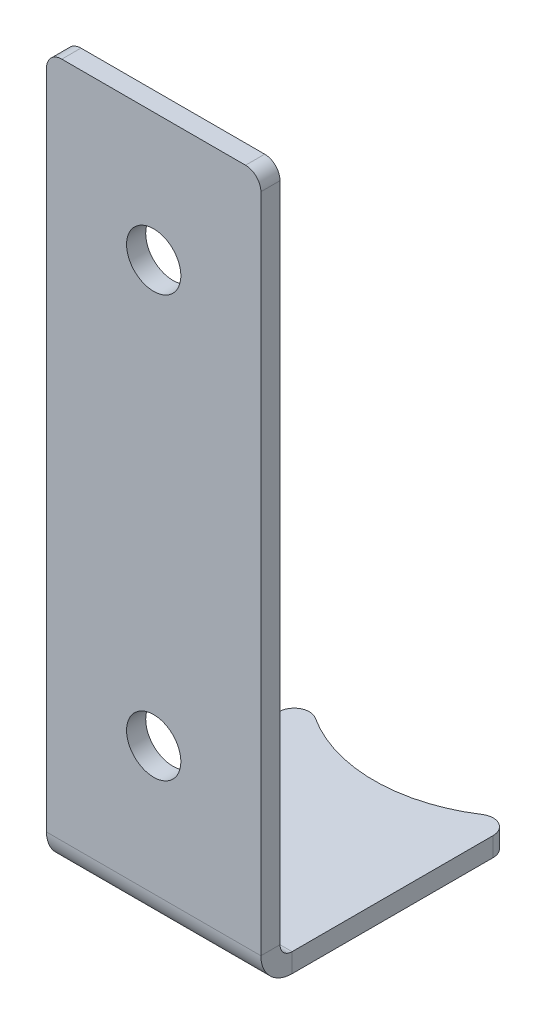
ISO-10303-21;
HEADER;
FILE_DESCRIPTION(('STEP AP214'),'2;1');
FILE_NAME('part.step','',(''),(''),'','','');
FILE_SCHEMA(('AUTOMOTIVE_DESIGN { 1 0 10303 214 1 1 1 1 }'));
ENDSEC;
DATA;
#1=APPLICATION_CONTEXT('core data for automotive mechanical design processes');
#2=APPLICATION_PROTOCOL_DEFINITION('international standard','automotive_design',2000,#1);
#3=PRODUCT_CONTEXT('',#1,'mechanical');
#4=PRODUCT('Part','Part','',(#3));
#5=PRODUCT_RELATED_PRODUCT_CATEGORY('part','',(#4));
#6=PRODUCT_DEFINITION_FORMATION('','',#4);
#7=PRODUCT_DEFINITION_CONTEXT('part definition',#1,'design');
#8=PRODUCT_DEFINITION('design','',#6,#7);
#9=PRODUCT_DEFINITION_SHAPE('','',#8);
#10=(LENGTH_UNIT() NAMED_UNIT(*) SI_UNIT(.MILLI.,.METRE.));
#11=(NAMED_UNIT(*) PLANE_ANGLE_UNIT() SI_UNIT($,.RADIAN.));
#12=(NAMED_UNIT(*) SI_UNIT($,.STERADIAN.) SOLID_ANGLE_UNIT());
#13=UNCERTAINTY_MEASURE_WITH_UNIT(LENGTH_MEASURE(1.E-05),#10,'distance_accuracy_value','');
#14=(GEOMETRIC_REPRESENTATION_CONTEXT(3) GLOBAL_UNCERTAINTY_ASSIGNED_CONTEXT((#13)) GLOBAL_UNIT_ASSIGNED_CONTEXT((#10,
#11,#12)) REPRESENTATION_CONTEXT('',''));
#15=CARTESIAN_POINT('',(0.,0.,0.));
#16=DIRECTION('',(0.,0.,1.));
#17=DIRECTION('',(1.,0.,0.));
#18=AXIS2_PLACEMENT_3D('',#15,#16,#17);
#19=CARTESIAN_POINT('',(0.,-1.5875,-1.14491749414469E-13));
#20=DIRECTION('',(0.,1.,0.));
#21=DIRECTION('',(0.,0.,1.));
#22=AXIS2_PLACEMENT_3D('',#19,#20,#21);
#23=CYLINDRICAL_SURFACE('',#22,12.7000000000001);
#24=CARTESIAN_POINT('',(0.,0.,-1.14491749414469E-13));
#25=DIRECTION('',(0.,-1.,0.));
#26=DIRECTION('',(0.,0.,1.));
#27=AXIS2_PLACEMENT_3D('',#24,#25,#26);
#28=CIRCLE('',#27,12.7000000000001);
#29=CARTESIAN_POINT('',(6.92727272727273,0.,10.6443831461472));
#30=VERTEX_POINT('',#29);
#31=CARTESIAN_POINT('',(-6.92727272727273,0.,10.6443831461472));
#32=VERTEX_POINT('',#31);
#33=EDGE_CURVE('E215',#30,#32,#28,.T.);
#34=ORIENTED_EDGE('',*,*,#33,.F.);
#35=DIRECTION('',(0.,1.,0.));
#36=VECTOR('',#35,1.);
#37=CARTESIAN_POINT('',(6.92727272727274,-1.5875,10.6443831461472));
#38=LINE('',#37,#36);
#39=CARTESIAN_POINT('',(6.92727272727273,-1.5875,10.6443831461472));
#40=VERTEX_POINT('',#39);
#41=EDGE_CURVE('E259',#30,#40,#38,.F.);
#42=ORIENTED_EDGE('',*,*,#41,.T.);
#43=CARTESIAN_POINT('',(0.,-1.5875,-1.14491749414469E-13));
#44=DIRECTION('',(0.,-1.,0.));
#45=DIRECTION('',(0.,0.,1.));
#46=AXIS2_PLACEMENT_3D('',#43,#44,#45);
#47=CIRCLE('',#46,12.7000000000001);
#48=CARTESIAN_POINT('',(-6.92727272727273,-1.5875,10.6443831461472));
#49=VERTEX_POINT('',#48);
#50=EDGE_CURVE('E218',#40,#49,#47,.T.);
#51=ORIENTED_EDGE('',*,*,#50,.T.);
#52=DIRECTION('',(0.,1.,0.));
#53=VECTOR('',#52,1.);
#54=CARTESIAN_POINT('',(-6.92727272727273,-1.5875,10.6443831461472));
#55=LINE('',#54,#53);
#56=EDGE_CURVE('E256',#49,#32,#55,.T.);
#57=ORIENTED_EDGE('',*,*,#56,.T.);
#58=EDGE_LOOP('',(#34,#42,#51,#57));
#59=FACE_BOUND('',#58,.T.);
#60=ADVANCED_FACE('F59',(#59),#23,.F.);
#61=CARTESIAN_POINT('',(8.89,-1.5875,9.06961410424942));
#62=DIRECTION('',(1.,0.,0.));
#63=DIRECTION('',(0.,0.,-1.));
#64=AXIS2_PLACEMENT_3D('',#61,#62,#63);
#65=PLANE('',#64);
#66=DIRECTION('',(0.,0.,-1.));
#67=VECTOR('',#66,1.);
#68=CARTESIAN_POINT('',(8.89,-1.5875,9.06961410424942));
#69=LINE('',#68,#67);
#70=CARTESIAN_POINT('',(8.89,-1.5875,28.3896141042494));
#71=VERTEX_POINT('',#70);
#72=CARTESIAN_POINT('',(8.89,-1.5875,11.7088214607619));
#73=VERTEX_POINT('',#72);
#74=EDGE_CURVE('E223',#71,#73,#69,.T.);
#75=ORIENTED_EDGE('',*,*,#74,.T.);
#76=DIRECTION('',(0.,1.,0.));
#77=VECTOR('',#76,1.);
#78=CARTESIAN_POINT('',(8.89,-1.5875,11.7088214607619));
#79=LINE('',#78,#77);
#80=CARTESIAN_POINT('',(8.89,0.,11.7088214607619));
#81=VERTEX_POINT('',#80);
#82=EDGE_CURVE('E249',#73,#81,#79,.T.);
#83=ORIENTED_EDGE('',*,*,#82,.T.);
#84=DIRECTION('',(0.,0.,-1.));
#85=VECTOR('',#84,1.);
#86=CARTESIAN_POINT('',(8.89,0.,9.06961410424942));
#87=LINE('',#86,#85);
#88=CARTESIAN_POINT('',(8.89,0.,28.3896141042494));
#89=VERTEX_POINT('',#88);
#90=EDGE_CURVE('E221',#89,#81,#87,.T.);
#91=ORIENTED_EDGE('',*,*,#90,.F.);
#92=DIRECTION('',(0.,-1.,0.));
#93=VECTOR('',#92,1.);
#94=CARTESIAN_POINT('',(8.89,0.,28.3896141042494));
#95=LINE('',#94,#93);
#96=EDGE_CURVE('E204',#89,#71,#95,.T.);
#97=ORIENTED_EDGE('',*,*,#96,.T.);
#98=EDGE_LOOP('',(#75,#83,#91,#97));
#99=FACE_BOUND('',#98,.T.);
#100=ADVANCED_FACE('F267',(#99),#65,.T.);
#101=CARTESIAN_POINT('',(-8.88999999999999,-1.5875,9.06961410424942));
#102=DIRECTION('',(-1.,0.,0.));
#103=DIRECTION('',(0.,0.,1.));
#104=AXIS2_PLACEMENT_3D('',#101,#102,#103);
#105=PLANE('',#104);
#106=DIRECTION('',(0.,0.,1.));
#107=VECTOR('',#106,1.);
#108=CARTESIAN_POINT('',(-8.88999999999999,0.,9.06961410424942));
#109=LINE('',#108,#107);
#110=CARTESIAN_POINT('',(-8.88999999999999,0.,11.708821460762));
#111=VERTEX_POINT('',#110);
#112=CARTESIAN_POINT('',(-8.88999999999999,0.,28.3896141042494));
#113=VERTEX_POINT('',#112);
#114=EDGE_CURVE('E229',#111,#113,#109,.T.);
#115=ORIENTED_EDGE('',*,*,#114,.F.);
#116=DIRECTION('',(0.,1.,0.));
#117=VECTOR('',#116,1.);
#118=CARTESIAN_POINT('',(-8.88999999999999,-1.5875,11.708821460762));
#119=LINE('',#118,#117);
#120=CARTESIAN_POINT('',(-8.88999999999999,-1.5875,11.708821460762));
#121=VERTEX_POINT('',#120);
#122=EDGE_CURVE('E13',#111,#121,#119,.F.);
#123=ORIENTED_EDGE('',*,*,#122,.T.);
#124=DIRECTION('',(0.,0.,1.));
#125=VECTOR('',#124,1.);
#126=CARTESIAN_POINT('',(-8.88999999999999,-1.5875,9.06961410424942));
#127=LINE('',#126,#125);
#128=CARTESIAN_POINT('',(-8.88999999999999,-1.5875,28.3896141042494));
#129=VERTEX_POINT('',#128);
#130=EDGE_CURVE('E220',#121,#129,#127,.T.);
#131=ORIENTED_EDGE('',*,*,#130,.T.);
#132=DIRECTION('',(0.,-1.,0.));
#133=VECTOR('',#132,1.);
#134=CARTESIAN_POINT('',(-8.88999999999999,0.,28.3896141042494));
#135=LINE('',#134,#133);
#136=EDGE_CURVE('E212',#113,#129,#135,.T.);
#137=ORIENTED_EDGE('',*,*,#136,.F.);
#138=EDGE_LOOP('',(#115,#123,#131,#137));
#139=FACE_BOUND('',#138,.T.);
#140=ADVANCED_FACE('F278',(#139),#105,.T.);
#141=CARTESIAN_POINT('',(0.,-1.5875,-1.14491749414469E-13));
#142=DIRECTION('',(0.,1.,0.));
#143=DIRECTION('',(0.,0.,1.));
#144=AXIS2_PLACEMENT_3D('',#141,#142,#143);
#145=PLANE('',#144);
#146=ORIENTED_EDGE('',*,*,#50,.F.);
#147=CARTESIAN_POINT('',(7.62,-1.5875,11.7088214607619));
#148=DIRECTION('',(0.,1.,0.));
#149=DIRECTION('',(0.,0.,1.));
#150=AXIS2_PLACEMENT_3D('',#147,#148,#149);
#151=CIRCLE('',#150,1.27);
#152=EDGE_CURVE('E67',#40,#73,#151,.F.);
#153=ORIENTED_EDGE('',*,*,#152,.T.);
#154=ORIENTED_EDGE('',*,*,#74,.F.);
#155=DIRECTION('',(1.,0.,0.));
#156=VECTOR('',#155,1.);
#157=CARTESIAN_POINT('',(8.89,-1.5875,28.3896141042494));
#158=LINE('',#157,#156);
#159=EDGE_CURVE('E156',#71,#129,#158,.F.);
#160=ORIENTED_EDGE('',*,*,#159,.T.);
#161=ORIENTED_EDGE('',*,*,#130,.F.);
#162=CARTESIAN_POINT('',(-7.61999999999999,-1.5875,11.708821460762));
#163=DIRECTION('',(0.,1.,0.));
#164=DIRECTION('',(0.,0.,1.));
#165=AXIS2_PLACEMENT_3D('',#162,#163,#164);
#166=CIRCLE('',#165,1.27);
#167=EDGE_CURVE('E79',#121,#49,#166,.F.);
#168=ORIENTED_EDGE('',*,*,#167,.T.);
#169=EDGE_LOOP('',(#146,#153,#154,#160,#161,#168));
#170=FACE_BOUND('',#169,.T.);
#171=ADVANCED_FACE('F262',(#170),#145,.F.);
#172=CARTESIAN_POINT('',(0.,0.,-1.14491749414469E-13));
#173=DIRECTION('',(0.,1.,0.));
#174=DIRECTION('',(0.,0.,1.));
#175=AXIS2_PLACEMENT_3D('',#172,#173,#174);
#176=PLANE('',#175);
#177=ORIENTED_EDGE('',*,*,#90,.T.);
#178=CARTESIAN_POINT('',(7.62,0.,11.7088214607619));
#179=DIRECTION('',(0.,1.,0.));
#180=DIRECTION('',(0.,0.,1.));
#181=AXIS2_PLACEMENT_3D('',#178,#179,#180);
#182=CIRCLE('',#181,1.27);
#183=EDGE_CURVE('E254',#81,#30,#182,.T.);
#184=ORIENTED_EDGE('',*,*,#183,.T.);
#185=ORIENTED_EDGE('',*,*,#33,.T.);
#186=CARTESIAN_POINT('',(-7.61999999999999,0.,11.708821460762));
#187=DIRECTION('',(0.,1.,0.));
#188=DIRECTION('',(0.,0.,1.));
#189=AXIS2_PLACEMENT_3D('',#186,#187,#188);
#190=CIRCLE('',#189,1.27);
#191=EDGE_CURVE('E252',#32,#111,#190,.T.);
#192=ORIENTED_EDGE('',*,*,#191,.T.);
#193=ORIENTED_EDGE('',*,*,#114,.T.);
#194=DIRECTION('',(1.,0.,0.));
#195=VECTOR('',#194,1.);
#196=CARTESIAN_POINT('',(8.89,0.,28.3896141042494));
#197=LINE('',#196,#195);
#198=EDGE_CURVE('E208',#89,#113,#197,.F.);
#199=ORIENTED_EDGE('',*,*,#198,.F.);
#200=EDGE_LOOP('',(#177,#184,#185,#192,#193,#199));
#201=FACE_BOUND('',#200,.T.);
#202=ADVANCED_FACE('F272',(#201),#176,.T.);
#203=CARTESIAN_POINT('',(-8.88999999999999,0.999999999999997,28.3896141042494));
#204=DIRECTION('',(-1.,0.,0.));
#205=DIRECTION('',(0.,0.,1.));
#206=AXIS2_PLACEMENT_3D('',#203,#204,#205);
#207=PLANE('',#206);
#208=DIRECTION('',(0.,0.,-1.));
#209=VECTOR('',#208,1.);
#210=CARTESIAN_POINT('',(-8.88999999999999,0.999999999999997,30.9771141042494));
#211=LINE('',#210,#209);
#212=CARTESIAN_POINT('',(-8.88999999999999,0.999999999999997,29.3896141042494));
#213=VERTEX_POINT('',#212);
#214=CARTESIAN_POINT('',(-8.88999999999999,0.999999999999997,30.9771141042494));
#215=VERTEX_POINT('',#214);
#216=EDGE_CURVE('E198',#213,#215,#211,.F.);
#217=ORIENTED_EDGE('',*,*,#216,.F.);
#218=CARTESIAN_POINT('',(-8.88999999999999,0.999999999999997,28.3896141042494));
#219=DIRECTION('',(1.,0.,0.));
#220=DIRECTION('',(0.,0.,-1.));
#221=AXIS2_PLACEMENT_3D('',#218,#219,#220);
#222=CIRCLE('',#221,1.);
#223=EDGE_CURVE('E159',#113,#213,#222,.F.);
#224=ORIENTED_EDGE('',*,*,#223,.F.);
#225=ORIENTED_EDGE('',*,*,#136,.T.);
#226=CARTESIAN_POINT('',(-8.88999999999999,0.999999999999997,28.3896141042494));
#227=DIRECTION('',(1.,0.,0.));
#228=DIRECTION('',(0.,0.,-1.));
#229=AXIS2_PLACEMENT_3D('',#226,#227,#228);
#230=CIRCLE('',#229,2.5875);
#231=EDGE_CURVE('E203',#129,#215,#230,.F.);
#232=ORIENTED_EDGE('',*,*,#231,.T.);
#233=EDGE_LOOP('',(#217,#224,#225,#232));
#234=FACE_BOUND('',#233,.T.);
#235=ADVANCED_FACE('F282',(#234),#207,.T.);
#236=CARTESIAN_POINT('',(8.89,0.999999999999997,28.3896141042494));
#237=DIRECTION('',(-1.,0.,0.));
#238=DIRECTION('',(0.,0.,1.));
#239=AXIS2_PLACEMENT_3D('',#236,#237,#238);
#240=PLANE('',#239);
#241=CARTESIAN_POINT('',(8.89,0.999999999999997,28.3896141042494));
#242=DIRECTION('',(1.,0.,0.));
#243=DIRECTION('',(0.,0.,-1.));
#244=AXIS2_PLACEMENT_3D('',#241,#242,#243);
#245=CIRCLE('',#244,1.);
#246=CARTESIAN_POINT('',(8.89,0.999999999999997,29.3896141042494));
#247=VERTEX_POINT('',#246);
#248=EDGE_CURVE('E166',#247,#89,#245,.T.);
#249=ORIENTED_EDGE('',*,*,#248,.F.);
#250=DIRECTION('',(0.,0.,-1.));
#251=VECTOR('',#250,1.);
#252=CARTESIAN_POINT('',(8.89,0.999999999999997,29.3896141042494));
#253=LINE('',#252,#251);
#254=CARTESIAN_POINT('',(8.89,0.999999999999997,30.9771141042494));
#255=VERTEX_POINT('',#254);
#256=EDGE_CURVE('E163',#247,#255,#253,.F.);
#257=ORIENTED_EDGE('',*,*,#256,.T.);
#258=CARTESIAN_POINT('',(8.89,0.999999999999997,28.3896141042494));
#259=DIRECTION('',(1.,0.,0.));
#260=DIRECTION('',(0.,0.,-1.));
#261=AXIS2_PLACEMENT_3D('',#258,#259,#260);
#262=CIRCLE('',#261,2.5875);
#263=EDGE_CURVE('E148',#255,#71,#262,.T.);
#264=ORIENTED_EDGE('',*,*,#263,.T.);
#265=ORIENTED_EDGE('',*,*,#96,.F.);
#266=EDGE_LOOP('',(#249,#257,#264,#265));
#267=FACE_BOUND('',#266,.T.);
#268=ADVANCED_FACE('F164',(#267),#240,.F.);
#269=CARTESIAN_POINT('',(8.89,0.999999999999997,28.3896141042494));
#270=DIRECTION('',(1.,0.,0.));
#271=DIRECTION('',(0.,0.,1.));
#272=AXIS2_PLACEMENT_3D('',#269,#270,#271);
#273=CYLINDRICAL_SURFACE('',#272,2.5875);
#274=ORIENTED_EDGE('',*,*,#159,.F.);
#275=ORIENTED_EDGE('',*,*,#263,.F.);
#276=DIRECTION('',(1.,0.,0.));
#277=VECTOR('',#276,1.);
#278=CARTESIAN_POINT('',(-8.89,0.999999999999997,30.9771141042494));
#279=LINE('',#278,#277);
#280=EDGE_CURVE('E153',#255,#215,#279,.F.);
#281=ORIENTED_EDGE('',*,*,#280,.T.);
#282=ORIENTED_EDGE('',*,*,#231,.F.);
#283=EDGE_LOOP('',(#274,#275,#281,#282));
#284=FACE_BOUND('',#283,.T.);
#285=ADVANCED_FACE('F150',(#284),#273,.T.);
#286=CARTESIAN_POINT('',(8.89,0.999999999999997,28.3896141042494));
#287=DIRECTION('',(1.,0.,0.));
#288=DIRECTION('',(0.,0.,1.));
#289=AXIS2_PLACEMENT_3D('',#286,#287,#288);
#290=CYLINDRICAL_SURFACE('',#289,1.);
#291=ORIENTED_EDGE('',*,*,#198,.T.);
#292=ORIENTED_EDGE('',*,*,#223,.T.);
#293=DIRECTION('',(1.,0.,0.));
#294=VECTOR('',#293,1.);
#295=CARTESIAN_POINT('',(-8.89,0.999999999999997,29.3896141042494));
#296=LINE('',#295,#294);
#297=EDGE_CURVE('E171',#213,#247,#296,.T.);
#298=ORIENTED_EDGE('',*,*,#297,.T.);
#299=ORIENTED_EDGE('',*,*,#248,.T.);
#300=EDGE_LOOP('',(#291,#292,#298,#299));
#301=FACE_BOUND('',#300,.T.);
#302=ADVANCED_FACE('F285',(#301),#290,.F.);
#303=CARTESIAN_POINT('',(8.88999999999998,57.15,30.9771141042494));
#304=DIRECTION('',(-1.,0.,0.));
#305=DIRECTION('',(0.,-1.,0.));
#306=AXIS2_PLACEMENT_3D('',#303,#304,#305);
#307=PLANE('',#306);
#308=DIRECTION('',(0.,-1.,0.));
#309=VECTOR('',#308,1.);
#310=CARTESIAN_POINT('',(8.88999999999998,57.15,29.3896141042494));
#311=LINE('',#310,#309);
#312=CARTESIAN_POINT('',(8.88999999999998,55.88,29.3896141042494));
#313=VERTEX_POINT('',#312);
#314=EDGE_CURVE('E180',#247,#313,#311,.F.);
#315=ORIENTED_EDGE('',*,*,#314,.T.);
#316=DIRECTION('',(0.,0.,-1.));
#317=VECTOR('',#316,1.);
#318=CARTESIAN_POINT('',(8.88999999999998,55.88,30.9771141042494));
#319=LINE('',#318,#317);
#320=CARTESIAN_POINT('',(8.88999999999998,55.88,30.9771141042494));
#321=VERTEX_POINT('',#320);
#322=EDGE_CURVE('E184',#313,#321,#319,.F.);
#323=ORIENTED_EDGE('',*,*,#322,.T.);
#324=DIRECTION('',(0.,1.,0.));
#325=VECTOR('',#324,1.);
#326=CARTESIAN_POINT('',(8.89,0.,30.9771141042494));
#327=LINE('',#326,#325);
#328=EDGE_CURVE('E176',#255,#321,#327,.T.);
#329=ORIENTED_EDGE('',*,*,#328,.F.);
#330=ORIENTED_EDGE('',*,*,#256,.F.);
#331=EDGE_LOOP('',(#315,#323,#329,#330));
#332=FACE_BOUND('',#331,.T.);
#333=ADVANCED_FACE('F182',(#332),#307,.F.);
#334=CARTESIAN_POINT('',(-8.88999999999999,0.,30.9771141042494));
#335=DIRECTION('',(1.,0.,0.));
#336=DIRECTION('',(0.,1.,0.));
#337=AXIS2_PLACEMENT_3D('',#334,#335,#336);
#338=PLANE('',#337);
#339=DIRECTION('',(0.,-1.,0.));
#340=VECTOR('',#339,1.);
#341=CARTESIAN_POINT('',(-8.88999999999999,0.,30.9771141042494));
#342=LINE('',#341,#340);
#343=CARTESIAN_POINT('',(-8.89000000000001,55.88,30.9771141042494));
#344=VERTEX_POINT('',#343);
#345=EDGE_CURVE('E179',#344,#215,#342,.T.);
#346=ORIENTED_EDGE('',*,*,#345,.F.);
#347=DIRECTION('',(0.,0.,-1.));
#348=VECTOR('',#347,1.);
#349=CARTESIAN_POINT('',(-8.89000000000001,55.88,30.9771141042494));
#350=LINE('',#349,#348);
#351=CARTESIAN_POINT('',(-8.89000000000001,55.88,29.3896141042494));
#352=VERTEX_POINT('',#351);
#353=EDGE_CURVE('E246',#344,#352,#350,.T.);
#354=ORIENTED_EDGE('',*,*,#353,.T.);
#355=DIRECTION('',(0.,1.,0.));
#356=VECTOR('',#355,1.);
#357=CARTESIAN_POINT('',(-8.88999999999999,0.,29.3896141042494));
#358=LINE('',#357,#356);
#359=EDGE_CURVE('E186',#352,#213,#358,.F.);
#360=ORIENTED_EDGE('',*,*,#359,.T.);
#361=ORIENTED_EDGE('',*,*,#216,.T.);
#362=EDGE_LOOP('',(#346,#354,#360,#361));
#363=FACE_BOUND('',#362,.T.);
#364=ADVANCED_FACE('F302',(#363),#338,.F.);
#365=CARTESIAN_POINT('',(0.,0.,30.9771141042494));
#366=DIRECTION('',(0.,0.,-1.));
#367=DIRECTION('',(-1.,0.,0.));
#368=AXIS2_PLACEMENT_3D('',#365,#366,#367);
#369=PLANE('',#368);
#370=CARTESIAN_POINT('',(0.,46.5249998979985,30.9771141042494));
#371=DIRECTION('',(0.,0.,-1.));
#372=DIRECTION('',(-1.,0.,0.));
#373=AXIS2_PLACEMENT_3D('',#370,#371,#372);
#374=CIRCLE('',#373,2.24999999999999);
#375=CARTESIAN_POINT('',(-2.24999999999999,46.5249998979985,30.9771141042494));
#376=VERTEX_POINT('',#375);
#377=EDGE_CURVE('E309',#376,#376,#374,.T.);
#378=ORIENTED_EDGE('',*,*,#377,.T.);
#379=EDGE_LOOP('',(#378));
#380=FACE_BOUND('',#379,.T.);
#381=CARTESIAN_POINT('',(0.,11.6250000000047,30.9771141042494));
#382=DIRECTION('',(0.,0.,-1.));
#383=DIRECTION('',(-1.,0.,0.));
#384=AXIS2_PLACEMENT_3D('',#381,#382,#383);
#385=CIRCLE('',#384,2.24999999999999);
#386=CARTESIAN_POINT('',(-2.25,11.6250000000047,30.9771141042494));
#387=VERTEX_POINT('',#386);
#388=EDGE_CURVE('E201',#387,#387,#385,.T.);
#389=ORIENTED_EDGE('',*,*,#388,.T.);
#390=EDGE_LOOP('',(#389));
#391=FACE_BOUND('',#390,.T.);
#392=ORIENTED_EDGE('',*,*,#328,.T.);
#393=CARTESIAN_POINT('',(7.61999999999998,55.88,30.9771141042494));
#394=DIRECTION('',(0.,0.,-1.));
#395=DIRECTION('',(-1.,0.,0.));
#396=AXIS2_PLACEMENT_3D('',#393,#394,#395);
#397=CIRCLE('',#396,1.27);
#398=CARTESIAN_POINT('',(7.61999999999998,57.15,30.9771141042494));
#399=VERTEX_POINT('',#398);
#400=EDGE_CURVE('E244',#321,#399,#397,.F.);
#401=ORIENTED_EDGE('',*,*,#400,.T.);
#402=DIRECTION('',(-1.,0.,0.));
#403=VECTOR('',#402,1.);
#404=CARTESIAN_POINT('',(0.,57.15,30.9771141042494));
#405=LINE('',#404,#403);
#406=CARTESIAN_POINT('',(-7.62000000000001,57.15,30.9771141042494));
#407=VERTEX_POINT('',#406);
#408=EDGE_CURVE('E185',#399,#407,#405,.T.);
#409=ORIENTED_EDGE('',*,*,#408,.T.);
#410=CARTESIAN_POINT('',(-7.62000000000001,55.88,30.9771141042494));
#411=DIRECTION('',(0.,0.,-1.));
#412=DIRECTION('',(-1.,0.,0.));
#413=AXIS2_PLACEMENT_3D('',#410,#411,#412);
#414=CIRCLE('',#413,1.27);
#415=EDGE_CURVE('E242',#407,#344,#414,.F.);
#416=ORIENTED_EDGE('',*,*,#415,.T.);
#417=ORIENTED_EDGE('',*,*,#345,.T.);
#418=ORIENTED_EDGE('',*,*,#280,.F.);
#419=EDGE_LOOP('',(#392,#401,#409,#416,#417,#418));
#420=FACE_BOUND('',#419,.T.);
#421=ADVANCED_FACE('F175',(#380,#391,#420),#369,.F.);
#422=CARTESIAN_POINT('',(0.,0.,29.3896141042494));
#423=DIRECTION('',(0.,0.,-1.));
#424=DIRECTION('',(-1.,0.,0.));
#425=AXIS2_PLACEMENT_3D('',#422,#423,#424);
#426=PLANE('',#425);
#427=CARTESIAN_POINT('',(0.,46.5249998979985,29.3896141042494));
#428=DIRECTION('',(0.,0.,-1.));
#429=DIRECTION('',(-1.,0.,0.));
#430=AXIS2_PLACEMENT_3D('',#427,#428,#429);
#431=CIRCLE('',#430,2.24999999999999);
#432=CARTESIAN_POINT('',(-2.24999999999999,46.5249998979985,29.3896141042494));
#433=VERTEX_POINT('',#432);
#434=EDGE_CURVE('E312',#433,#433,#431,.T.);
#435=ORIENTED_EDGE('',*,*,#434,.F.);
#436=EDGE_LOOP('',(#435));
#437=FACE_BOUND('',#436,.T.);
#438=CARTESIAN_POINT('',(0.,11.6250000000047,29.3896141042494));
#439=DIRECTION('',(0.,0.,-1.));
#440=DIRECTION('',(-1.,0.,0.));
#441=AXIS2_PLACEMENT_3D('',#438,#439,#440);
#442=CIRCLE('',#441,2.24999999999999);
#443=CARTESIAN_POINT('',(-2.25,11.6250000000047,29.3896141042494));
#444=VERTEX_POINT('',#443);
#445=EDGE_CURVE('E306',#444,#444,#442,.T.);
#446=ORIENTED_EDGE('',*,*,#445,.F.);
#447=EDGE_LOOP('',(#446));
#448=FACE_BOUND('',#447,.T.);
#449=DIRECTION('',(1.,0.,0.));
#450=VECTOR('',#449,1.);
#451=CARTESIAN_POINT('',(-8.89000000000001,57.15,29.3896141042494));
#452=LINE('',#451,#450);
#453=CARTESIAN_POINT('',(7.61999999999998,57.15,29.3896141042494));
#454=VERTEX_POINT('',#453);
#455=CARTESIAN_POINT('',(-7.62000000000001,57.15,29.3896141042494));
#456=VERTEX_POINT('',#455);
#457=EDGE_CURVE('E190',#454,#456,#452,.F.);
#458=ORIENTED_EDGE('',*,*,#457,.F.);
#459=CARTESIAN_POINT('',(7.61999999999998,55.88,29.3896141042494));
#460=DIRECTION('',(0.,0.,-1.));
#461=DIRECTION('',(-1.,0.,0.));
#462=AXIS2_PLACEMENT_3D('',#459,#460,#461);
#463=CIRCLE('',#462,1.27);
#464=EDGE_CURVE('E239',#454,#313,#463,.T.);
#465=ORIENTED_EDGE('',*,*,#464,.T.);
#466=ORIENTED_EDGE('',*,*,#314,.F.);
#467=ORIENTED_EDGE('',*,*,#297,.F.);
#468=ORIENTED_EDGE('',*,*,#359,.F.);
#469=CARTESIAN_POINT('',(-7.62000000000001,55.88,29.3896141042494));
#470=DIRECTION('',(0.,0.,-1.));
#471=DIRECTION('',(-1.,0.,0.));
#472=AXIS2_PLACEMENT_3D('',#469,#470,#471);
#473=CIRCLE('',#472,1.27);
#474=EDGE_CURVE('E237',#352,#456,#473,.T.);
#475=ORIENTED_EDGE('',*,*,#474,.T.);
#476=EDGE_LOOP('',(#458,#465,#466,#467,#468,#475));
#477=FACE_BOUND('',#476,.T.);
#478=ADVANCED_FACE('F289',(#437,#448,#477),#426,.T.);
#479=CARTESIAN_POINT('',(-8.89000000000001,57.15,30.9771141042494));
#480=DIRECTION('',(0.,-1.,0.));
#481=DIRECTION('',(0.,0.,-1.));
#482=AXIS2_PLACEMENT_3D('',#479,#480,#481);
#483=PLANE('',#482);
#484=ORIENTED_EDGE('',*,*,#408,.F.);
#485=DIRECTION('',(0.,0.,-1.));
#486=VECTOR('',#485,1.);
#487=CARTESIAN_POINT('',(7.61999999999998,57.15,30.9771141042494));
#488=LINE('',#487,#486);
#489=EDGE_CURVE('E234',#399,#454,#488,.T.);
#490=ORIENTED_EDGE('',*,*,#489,.T.);
#491=ORIENTED_EDGE('',*,*,#457,.T.);
#492=DIRECTION('',(0.,0.,-1.));
#493=VECTOR('',#492,1.);
#494=CARTESIAN_POINT('',(-7.62000000000001,57.15,30.9771141042494));
#495=LINE('',#494,#493);
#496=EDGE_CURVE('E226',#456,#407,#495,.F.);
#497=ORIENTED_EDGE('',*,*,#496,.T.);
#498=EDGE_LOOP('',(#484,#490,#491,#497));
#499=FACE_BOUND('',#498,.T.);
#500=ADVANCED_FACE('F296',(#499),#483,.F.);
#501=CARTESIAN_POINT('',(0.,11.6250000000047,29.3896141042494));
#502=DIRECTION('',(0.,0.,-1.));
#503=DIRECTION('',(-1.,0.,0.));
#504=AXIS2_PLACEMENT_3D('',#501,#502,#503);
#505=CYLINDRICAL_SURFACE('',#504,2.24999999999999);
#506=ORIENTED_EDGE('',*,*,#388,.F.);
#507=EDGE_LOOP('',(#506));
#508=FACE_BOUND('',#507,.T.);
#509=ORIENTED_EDGE('',*,*,#445,.T.);
#510=EDGE_LOOP('',(#509));
#511=FACE_BOUND('',#510,.T.);
#512=ADVANCED_FACE('F323',(#508,#511),#505,.F.);
#513=CARTESIAN_POINT('',(0.,46.5249998979985,29.3896141042494));
#514=DIRECTION('',(0.,0.,-1.));
#515=DIRECTION('',(-1.,0.,0.));
#516=AXIS2_PLACEMENT_3D('',#513,#514,#515);
#517=CYLINDRICAL_SURFACE('',#516,2.24999999999999);
#518=ORIENTED_EDGE('',*,*,#377,.F.);
#519=EDGE_LOOP('',(#518));
#520=FACE_BOUND('',#519,.T.);
#521=ORIENTED_EDGE('',*,*,#434,.T.);
#522=EDGE_LOOP('',(#521));
#523=FACE_BOUND('',#522,.T.);
#524=ADVANCED_FACE('F316',(#520,#523),#517,.F.);
#525=CARTESIAN_POINT('',(7.61999999999998,55.88,30.9771141042494));
#526=DIRECTION('',(0.,0.,-1.));
#527=DIRECTION('',(-1.,0.,0.));
#528=AXIS2_PLACEMENT_3D('',#525,#526,#527);
#529=CYLINDRICAL_SURFACE('',#528,1.27);
#530=ORIENTED_EDGE('',*,*,#400,.F.);
#531=ORIENTED_EDGE('',*,*,#322,.F.);
#532=ORIENTED_EDGE('',*,*,#464,.F.);
#533=ORIENTED_EDGE('',*,*,#489,.F.);
#534=EDGE_LOOP('',(#530,#531,#532,#533));
#535=FACE_BOUND('',#534,.T.);
#536=ADVANCED_FACE('F291',(#535),#529,.T.);
#537=CARTESIAN_POINT('',(-7.62000000000001,55.88,30.9771141042494));
#538=DIRECTION('',(0.,0.,-1.));
#539=DIRECTION('',(-1.,0.,0.));
#540=AXIS2_PLACEMENT_3D('',#537,#538,#539);
#541=CYLINDRICAL_SURFACE('',#540,1.27);
#542=ORIENTED_EDGE('',*,*,#415,.F.);
#543=ORIENTED_EDGE('',*,*,#496,.F.);
#544=ORIENTED_EDGE('',*,*,#474,.F.);
#545=ORIENTED_EDGE('',*,*,#353,.F.);
#546=EDGE_LOOP('',(#542,#543,#544,#545));
#547=FACE_BOUND('',#546,.T.);
#548=ADVANCED_FACE('F299',(#547),#541,.T.);
#549=CARTESIAN_POINT('',(7.62,-1.5875,11.7088214607619));
#550=DIRECTION('',(0.,1.,0.));
#551=DIRECTION('',(0.,0.,1.));
#552=AXIS2_PLACEMENT_3D('',#549,#550,#551);
#553=CYLINDRICAL_SURFACE('',#552,1.27);
#554=ORIENTED_EDGE('',*,*,#152,.F.);
#555=ORIENTED_EDGE('',*,*,#41,.F.);
#556=ORIENTED_EDGE('',*,*,#183,.F.);
#557=ORIENTED_EDGE('',*,*,#82,.F.);
#558=EDGE_LOOP('',(#554,#555,#556,#557));
#559=FACE_BOUND('',#558,.T.);
#560=ADVANCED_FACE('F269',(#559),#553,.T.);
#561=CARTESIAN_POINT('',(-7.61999999999999,-1.5875,11.708821460762));
#562=DIRECTION('',(0.,1.,0.));
#563=DIRECTION('',(0.,0.,1.));
#564=AXIS2_PLACEMENT_3D('',#561,#562,#563);
#565=CYLINDRICAL_SURFACE('',#564,1.27);
#566=ORIENTED_EDGE('',*,*,#167,.F.);
#567=ORIENTED_EDGE('',*,*,#122,.F.);
#568=ORIENTED_EDGE('',*,*,#191,.F.);
#569=ORIENTED_EDGE('',*,*,#56,.F.);
#570=EDGE_LOOP('',(#566,#567,#568,#569));
#571=FACE_BOUND('',#570,.T.);
#572=ADVANCED_FACE('F61',(#571),#565,.T.);
#573=CLOSED_SHELL('',(#60,#100,#140,#171,#202,#235,#268,#285,#302,#333,#364,#421,#478,#500,#512,
#524,#536,#548,#560,#572));
#574=MANIFOLD_SOLID_BREP('B2',#573);
#575=ADVANCED_BREP_SHAPE_REPRESENTATION('',(#18,#574),#14);
#576=SHAPE_DEFINITION_REPRESENTATION(#9,#575);
ENDSEC;
END-ISO-10303-21;
